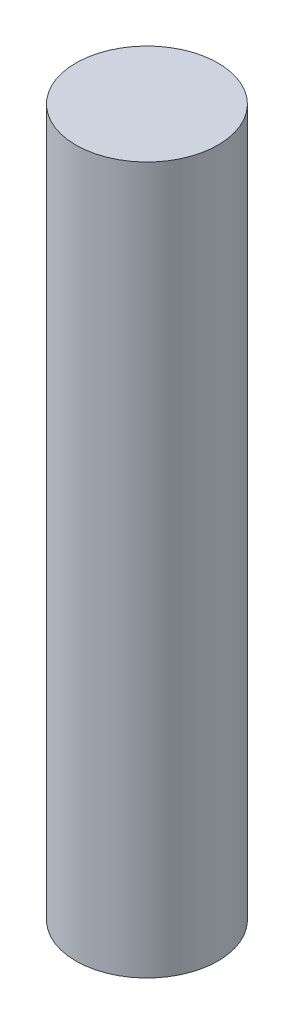
ISO-10303-21;
HEADER;
FILE_DESCRIPTION(('STEP AP214'),'2;1');
FILE_NAME('part.step','',(''),(''),'','','');
FILE_SCHEMA(('AUTOMOTIVE_DESIGN { 1 0 10303 214 1 1 1 1 }'));
ENDSEC;
DATA;
#1=APPLICATION_CONTEXT('core data for automotive mechanical design processes');
#2=APPLICATION_PROTOCOL_DEFINITION('international standard','automotive_design',2000,#1);
#3=PRODUCT_CONTEXT('',#1,'mechanical');
#4=PRODUCT('Part','Part','',(#3));
#5=PRODUCT_RELATED_PRODUCT_CATEGORY('part','',(#4));
#6=PRODUCT_DEFINITION_FORMATION('','',#4);
#7=PRODUCT_DEFINITION_CONTEXT('part definition',#1,'design');
#8=PRODUCT_DEFINITION('design','',#6,#7);
#9=PRODUCT_DEFINITION_SHAPE('','',#8);
#10=(LENGTH_UNIT() NAMED_UNIT(*) SI_UNIT(.MILLI.,.METRE.));
#11=(NAMED_UNIT(*) PLANE_ANGLE_UNIT() SI_UNIT($,.RADIAN.));
#12=(NAMED_UNIT(*) SI_UNIT($,.STERADIAN.) SOLID_ANGLE_UNIT());
#13=UNCERTAINTY_MEASURE_WITH_UNIT(LENGTH_MEASURE(1.E-05),#10,'distance_accuracy_value','');
#14=(GEOMETRIC_REPRESENTATION_CONTEXT(3) GLOBAL_UNCERTAINTY_ASSIGNED_CONTEXT((#13)) GLOBAL_UNIT_ASSIGNED_CONTEXT((#10,
#11,#12)) REPRESENTATION_CONTEXT('',''));
#15=CARTESIAN_POINT('',(0.,0.,0.));
#16=DIRECTION('',(0.,0.,1.));
#17=DIRECTION('',(1.,0.,0.));
#18=AXIS2_PLACEMENT_3D('',#15,#16,#17);
#19=CARTESIAN_POINT('',(0.,39.7689655172414,0.));
#20=DIRECTION('',(0.,-1.,0.));
#21=DIRECTION('',(0.,0.,-1.));
#22=AXIS2_PLACEMENT_3D('',#19,#20,#21);
#23=CYLINDRICAL_SURFACE('',#22,4.);
#24=CARTESIAN_POINT('',(0.,39.7689655172414,0.));
#25=DIRECTION('',(0.,1.,0.));
#26=DIRECTION('',(0.,0.,1.));
#27=AXIS2_PLACEMENT_3D('',#24,#25,#26);
#28=CIRCLE('',#27,4.);
#29=CARTESIAN_POINT('',(0.,39.7689655172414,4.));
#30=VERTEX_POINT('',#29);
#31=EDGE_CURVE('E10',#30,#30,#28,.T.);
#32=ORIENTED_EDGE('',*,*,#31,.F.);
#33=EDGE_LOOP('',(#32));
#34=FACE_BOUND('',#33,.T.);
#35=CARTESIAN_POINT('',(0.,0.,0.));
#36=DIRECTION('',(0.,1.,0.));
#37=DIRECTION('',(0.,0.,1.));
#38=AXIS2_PLACEMENT_3D('',#35,#36,#37);
#39=CIRCLE('',#38,4.);
#40=CARTESIAN_POINT('',(0.,0.,4.));
#41=VERTEX_POINT('',#40);
#42=EDGE_CURVE('E38',#41,#41,#39,.T.);
#43=ORIENTED_EDGE('',*,*,#42,.T.);
#44=EDGE_LOOP('',(#43));
#45=FACE_BOUND('',#44,.T.);
#46=ADVANCED_FACE('F35',(#34,#45),#23,.T.);
#47=CARTESIAN_POINT('',(0.,39.7689655172414,0.));
#48=DIRECTION('',(0.,1.,0.));
#49=DIRECTION('',(0.,0.,1.));
#50=AXIS2_PLACEMENT_3D('',#47,#48,#49);
#51=PLANE('',#50);
#52=ORIENTED_EDGE('',*,*,#31,.T.);
#53=EDGE_LOOP('',(#52));
#54=FACE_BOUND('',#53,.T.);
#55=ADVANCED_FACE('F50',(#54),#51,.T.);
#56=CARTESIAN_POINT('',(0.,0.,0.));
#57=DIRECTION('',(0.,1.,0.));
#58=DIRECTION('',(0.,0.,1.));
#59=AXIS2_PLACEMENT_3D('',#56,#57,#58);
#60=PLANE('',#59);
#61=ORIENTED_EDGE('',*,*,#42,.F.);
#62=EDGE_LOOP('',(#61));
#63=FACE_BOUND('',#62,.T.);
#64=ADVANCED_FACE('F48',(#63),#60,.F.);
#65=CLOSED_SHELL('',(#46,#55,#64));
#66=MANIFOLD_SOLID_BREP('B2',#65);
#67=ADVANCED_BREP_SHAPE_REPRESENTATION('',(#18,#66),#14);
#68=SHAPE_DEFINITION_REPRESENTATION(#9,#67);
ENDSEC;
END-ISO-10303-21;
